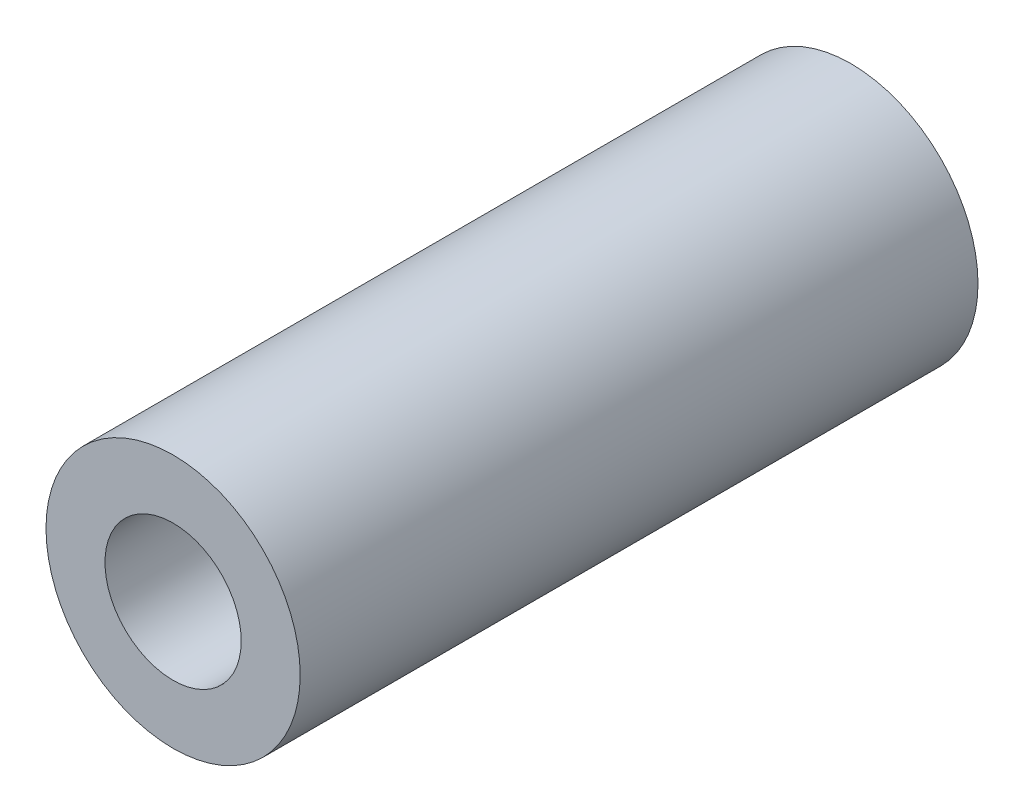
ISO-10303-21;
HEADER;
FILE_DESCRIPTION(('STEP AP214'),'2;1');
FILE_NAME('part.step','',(''),(''),'','','');
FILE_SCHEMA(('AUTOMOTIVE_DESIGN { 1 0 10303 214 1 1 1 1 }'));
ENDSEC;
DATA;
#1=APPLICATION_CONTEXT('core data for automotive mechanical design processes');
#2=APPLICATION_PROTOCOL_DEFINITION('international standard','automotive_design',2000,#1);
#3=PRODUCT_CONTEXT('',#1,'mechanical');
#4=PRODUCT('Part','Part','',(#3));
#5=PRODUCT_RELATED_PRODUCT_CATEGORY('part','',(#4));
#6=PRODUCT_DEFINITION_FORMATION('','',#4);
#7=PRODUCT_DEFINITION_CONTEXT('part definition',#1,'design');
#8=PRODUCT_DEFINITION('design','',#6,#7);
#9=PRODUCT_DEFINITION_SHAPE('','',#8);
#10=(LENGTH_UNIT() NAMED_UNIT(*) SI_UNIT(.MILLI.,.METRE.));
#11=(NAMED_UNIT(*) PLANE_ANGLE_UNIT() SI_UNIT($,.RADIAN.));
#12=(NAMED_UNIT(*) SI_UNIT($,.STERADIAN.) SOLID_ANGLE_UNIT());
#13=UNCERTAINTY_MEASURE_WITH_UNIT(LENGTH_MEASURE(1.E-05),#10,'distance_accuracy_value','');
#14=(GEOMETRIC_REPRESENTATION_CONTEXT(3) GLOBAL_UNCERTAINTY_ASSIGNED_CONTEXT((#13)) GLOBAL_UNIT_ASSIGNED_CONTEXT((#10,
#11,#12)) REPRESENTATION_CONTEXT('',''));
#15=CARTESIAN_POINT('',(0.,0.,0.));
#16=DIRECTION('',(0.,0.,1.));
#17=DIRECTION('',(1.,0.,0.));
#18=AXIS2_PLACEMENT_3D('',#15,#16,#17);
#19=CARTESIAN_POINT('',(0.,0.,25.4));
#20=DIRECTION('',(0.,0.,-1.));
#21=DIRECTION('',(-1.,0.,0.));
#22=AXIS2_PLACEMENT_3D('',#19,#20,#21);
#23=CYLINDRICAL_SURFACE('',#22,4.7625);
#24=CARTESIAN_POINT('',(0.,0.,25.4));
#25=DIRECTION('',(0.,0.,1.));
#26=DIRECTION('',(1.,0.,0.));
#27=AXIS2_PLACEMENT_3D('',#24,#25,#26);
#28=CIRCLE('',#27,4.7625);
#29=CARTESIAN_POINT('',(4.7625,0.,25.4));
#30=VERTEX_POINT('',#29);
#31=EDGE_CURVE('E10',#30,#30,#28,.T.);
#32=ORIENTED_EDGE('',*,*,#31,.F.);
#33=EDGE_LOOP('',(#32));
#34=FACE_BOUND('',#33,.T.);
#35=CARTESIAN_POINT('',(0.,0.,0.));
#36=DIRECTION('',(0.,0.,1.));
#37=DIRECTION('',(1.,0.,0.));
#38=AXIS2_PLACEMENT_3D('',#35,#36,#37);
#39=CIRCLE('',#38,4.7625);
#40=CARTESIAN_POINT('',(4.7625,0.,0.));
#41=VERTEX_POINT('',#40);
#42=EDGE_CURVE('E34',#41,#41,#39,.T.);
#43=ORIENTED_EDGE('',*,*,#42,.T.);
#44=EDGE_LOOP('',(#43));
#45=FACE_BOUND('',#44,.T.);
#46=ADVANCED_FACE('F31',(#34,#45),#23,.T.);
#47=CARTESIAN_POINT('',(0.,0.,25.4));
#48=DIRECTION('',(0.,0.,1.));
#49=DIRECTION('',(1.,0.,0.));
#50=AXIS2_PLACEMENT_3D('',#47,#48,#49);
#51=PLANE('',#50);
#52=CARTESIAN_POINT('',(0.,0.,25.4));
#53=DIRECTION('',(0.,0.,1.));
#54=DIRECTION('',(1.,0.,0.));
#55=AXIS2_PLACEMENT_3D('',#52,#53,#54);
#56=CIRCLE('',#55,2.5527);
#57=CARTESIAN_POINT('',(2.5527,0.,25.4));
#58=VERTEX_POINT('',#57);
#59=EDGE_CURVE('E45',#58,#58,#56,.T.);
#60=ORIENTED_EDGE('',*,*,#59,.F.);
#61=EDGE_LOOP('',(#60));
#62=FACE_BOUND('',#61,.T.);
#63=ORIENTED_EDGE('',*,*,#31,.T.);
#64=EDGE_LOOP('',(#63));
#65=FACE_BOUND('',#64,.T.);
#66=ADVANCED_FACE('F51',(#62,#65),#51,.T.);
#67=CARTESIAN_POINT('',(0.,0.,0.));
#68=DIRECTION('',(0.,0.,1.));
#69=DIRECTION('',(1.,0.,0.));
#70=AXIS2_PLACEMENT_3D('',#67,#68,#69);
#71=PLANE('',#70);
#72=CARTESIAN_POINT('',(0.,0.,0.));
#73=DIRECTION('',(0.,0.,1.));
#74=DIRECTION('',(1.,0.,0.));
#75=AXIS2_PLACEMENT_3D('',#72,#73,#74);
#76=CIRCLE('',#75,2.55269999999999);
#77=CARTESIAN_POINT('',(2.55269999999999,0.,0.));
#78=VERTEX_POINT('',#77);
#79=EDGE_CURVE('E41',#78,#78,#76,.T.);
#80=ORIENTED_EDGE('',*,*,#79,.T.);
#81=EDGE_LOOP('',(#80));
#82=FACE_BOUND('',#81,.T.);
#83=ORIENTED_EDGE('',*,*,#42,.F.);
#84=EDGE_LOOP('',(#83));
#85=FACE_BOUND('',#84,.T.);
#86=ADVANCED_FACE('F53',(#82,#85),#71,.F.);
#87=CARTESIAN_POINT('',(0.,0.,25.4));
#88=DIRECTION('',(0.,0.,1.));
#89=DIRECTION('',(1.,0.,0.));
#90=AXIS2_PLACEMENT_3D('',#87,#88,#89);
#91=CYLINDRICAL_SURFACE('',#90,2.5527);
#92=ORIENTED_EDGE('',*,*,#79,.F.);
#93=EDGE_LOOP('',(#92));
#94=FACE_BOUND('',#93,.T.);
#95=ORIENTED_EDGE('',*,*,#59,.T.);
#96=EDGE_LOOP('',(#95));
#97=FACE_BOUND('',#96,.T.);
#98=ADVANCED_FACE('F49',(#94,#97),#91,.F.);
#99=CLOSED_SHELL('',(#46,#66,#86,#98));
#100=MANIFOLD_SOLID_BREP('B2',#99);
#101=ADVANCED_BREP_SHAPE_REPRESENTATION('',(#18,#100),#14);
#102=SHAPE_DEFINITION_REPRESENTATION(#9,#101);
ENDSEC;
END-ISO-10303-21;
